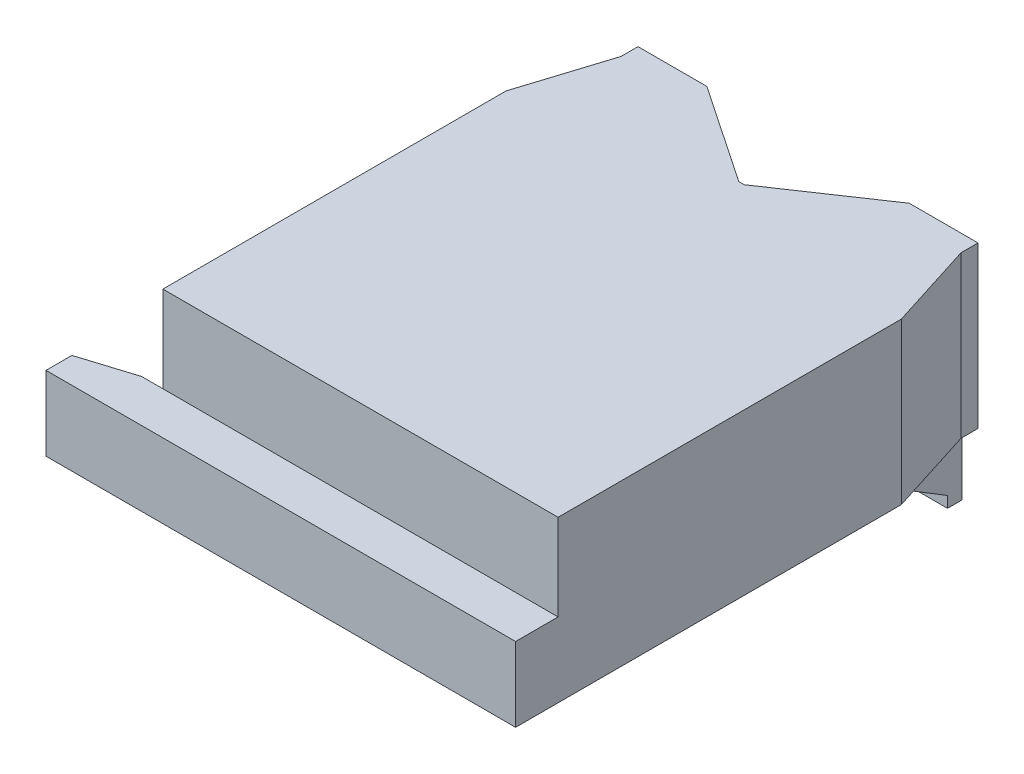
ISO-10303-21;
HEADER;
FILE_DESCRIPTION(('STEP AP214'),'2;1');
FILE_NAME('part.step','',(''),(''),'','','');
FILE_SCHEMA(('AUTOMOTIVE_DESIGN { 1 0 10303 214 1 1 1 1 }'));
ENDSEC;
DATA;
#1=APPLICATION_CONTEXT('core data for automotive mechanical design processes');
#2=APPLICATION_PROTOCOL_DEFINITION('international standard','automotive_design',2000,#1);
#3=PRODUCT_CONTEXT('',#1,'mechanical');
#4=PRODUCT('Part','Part','',(#3));
#5=PRODUCT_RELATED_PRODUCT_CATEGORY('part','',(#4));
#6=PRODUCT_DEFINITION_FORMATION('','',#4);
#7=PRODUCT_DEFINITION_CONTEXT('part definition',#1,'design');
#8=PRODUCT_DEFINITION('design','',#6,#7);
#9=PRODUCT_DEFINITION_SHAPE('','',#8);
#10=(LENGTH_UNIT() NAMED_UNIT(*) SI_UNIT(.MILLI.,.METRE.));
#11=(NAMED_UNIT(*) PLANE_ANGLE_UNIT() SI_UNIT($,.RADIAN.));
#12=(NAMED_UNIT(*) SI_UNIT($,.STERADIAN.) SOLID_ANGLE_UNIT());
#13=UNCERTAINTY_MEASURE_WITH_UNIT(LENGTH_MEASURE(1.E-05),#10,'distance_accuracy_value','');
#14=(GEOMETRIC_REPRESENTATION_CONTEXT(3) GLOBAL_UNCERTAINTY_ASSIGNED_CONTEXT((#13)) GLOBAL_UNIT_ASSIGNED_CONTEXT((#10,
#11,#12)) REPRESENTATION_CONTEXT('',''));
#15=CARTESIAN_POINT('',(0.,0.,0.));
#16=DIRECTION('',(0.,0.,1.));
#17=DIRECTION('',(1.,0.,0.));
#18=AXIS2_PLACEMENT_3D('',#15,#16,#17);
#19=CARTESIAN_POINT('',(-719.,2366.,1255.15));
#20=DIRECTION('',(0.,-1.,0.));
#21=DIRECTION('',(1.,0.,0.));
#22=AXIS2_PLACEMENT_3D('',#19,#20,#21);
#23=PLANE('',#22);
#24=DIRECTION('',(1.,0.,0.));
#25=VECTOR('',#24,1.);
#26=CARTESIAN_POINT('',(381.0784999709,2366.,-404.7));
#27=LINE('',#26,#25);
#28=CARTESIAN_POINT('',(381.0784999709,2366.,-404.7));
#29=VERTEX_POINT('',#28);
#30=CARTESIAN_POINT('',(640.,2366.,-404.7));
#31=VERTEX_POINT('',#30);
#32=EDGE_CURVE('E239',#29,#31,#27,.T.);
#33=ORIENTED_EDGE('',*,*,#32,.F.);
#34=DIRECTION('',(0.82903757255505,0.,-0.559192903470734));
#35=VECTOR('',#34,1.);
#36=CARTESIAN_POINT('',(10.,2366.,-154.404391352497));
#37=LINE('',#36,#35);
#38=CARTESIAN_POINT('',(10.,2366.,-154.404391352497));
#39=VERTEX_POINT('',#38);
#40=EDGE_CURVE('E42',#39,#29,#37,.T.);
#41=ORIENTED_EDGE('',*,*,#40,.F.);
#42=DIRECTION('',(1.,0.,0.));
#43=VECTOR('',#42,1.);
#44=CARTESIAN_POINT('',(-10.,2366.,-154.404391352497));
#45=LINE('',#44,#43);
#46=CARTESIAN_POINT('',(-10.,2366.,-154.404391352497));
#47=VERTEX_POINT('',#46);
#48=EDGE_CURVE('E391',#47,#39,#45,.T.);
#49=ORIENTED_EDGE('',*,*,#48,.F.);
#50=DIRECTION('',(0.82903757255505,0.,0.559192903470734));
#51=VECTOR('',#50,1.);
#52=CARTESIAN_POINT('',(-381.0784999709,2366.,-404.7));
#53=LINE('',#52,#51);
#54=CARTESIAN_POINT('',(-381.0784999709,2366.,-404.7));
#55=VERTEX_POINT('',#54);
#56=EDGE_CURVE('E228',#55,#47,#53,.T.);
#57=ORIENTED_EDGE('',*,*,#56,.F.);
#58=DIRECTION('',(1.,0.,0.));
#59=VECTOR('',#58,1.);
#60=CARTESIAN_POINT('',(-640.,2366.,-404.7));
#61=LINE('',#60,#59);
#62=CARTESIAN_POINT('',(-640.,2366.,-404.7));
#63=VERTEX_POINT('',#62);
#64=EDGE_CURVE('E238',#63,#55,#61,.T.);
#65=ORIENTED_EDGE('',*,*,#64,.F.);
#66=DIRECTION('',(0.,0.,-1.));
#67=VECTOR('',#66,1.);
#68=CARTESIAN_POINT('',(-640.,2366.,-340.6));
#69=LINE('',#68,#67);
#70=CARTESIAN_POINT('',(-640.,2366.,-340.6));
#71=VERTEX_POINT('',#70);
#72=EDGE_CURVE('E314',#71,#63,#69,.T.);
#73=ORIENTED_EDGE('',*,*,#72,.F.);
#74=DIRECTION('',(0.3018257621971,0.,-0.953363104632301));
#75=VECTOR('',#74,1.);
#76=CARTESIAN_POINT('',(-744.,2366.,-12.099999999997));
#77=LINE('',#76,#75);
#78=CARTESIAN_POINT('',(-744.,2366.,-12.099999999997));
#79=VERTEX_POINT('',#78);
#80=EDGE_CURVE('E262',#79,#71,#77,.T.);
#81=ORIENTED_EDGE('',*,*,#80,.F.);
#82=DIRECTION('',(0.,0.,-1.));
#83=VECTOR('',#82,1.);
#84=CARTESIAN_POINT('',(-744.,2366.,1280.15));
#85=LINE('',#84,#83);
#86=CARTESIAN_POINT('',(-744.,2366.,1280.15));
#87=VERTEX_POINT('',#86);
#88=EDGE_CURVE('E217',#87,#79,#85,.T.);
#89=ORIENTED_EDGE('',*,*,#88,.F.);
#90=DIRECTION('',(-1.,0.,0.));
#91=VECTOR('',#90,1.);
#92=CARTESIAN_POINT('',(744.,2366.,1280.15));
#93=LINE('',#92,#91);
#94=CARTESIAN_POINT('',(744.,2366.,1280.15));
#95=VERTEX_POINT('',#94);
#96=EDGE_CURVE('E271',#95,#87,#93,.T.);
#97=ORIENTED_EDGE('',*,*,#96,.F.);
#98=DIRECTION('',(0.,0.,1.));
#99=VECTOR('',#98,1.);
#100=CARTESIAN_POINT('',(744.,2366.,-12.099999999997));
#101=LINE('',#100,#99);
#102=CARTESIAN_POINT('',(744.,2366.,-12.099999999997));
#103=VERTEX_POINT('',#102);
#104=EDGE_CURVE('E256',#103,#95,#101,.T.);
#105=ORIENTED_EDGE('',*,*,#104,.F.);
#106=DIRECTION('',(0.3018257621971,0.,0.953363104632301));
#107=VECTOR('',#106,1.);
#108=CARTESIAN_POINT('',(640.,2366.,-340.6));
#109=LINE('',#108,#107);
#110=CARTESIAN_POINT('',(640.,2366.,-340.6));
#111=VERTEX_POINT('',#110);
#112=EDGE_CURVE('E186',#111,#103,#109,.T.);
#113=ORIENTED_EDGE('',*,*,#112,.F.);
#114=DIRECTION('',(0.,0.,1.));
#115=VECTOR('',#114,1.);
#116=CARTESIAN_POINT('',(640.,2366.,-404.7));
#117=LINE('',#116,#115);
#118=EDGE_CURVE('E28',#31,#111,#117,.T.);
#119=ORIENTED_EDGE('',*,*,#118,.F.);
#120=EDGE_LOOP('',(#33,#41,#49,#57,#65,#73,#81,#89,#97,#105,#113,#119));
#121=FACE_BOUND('',#120,.T.);
#122=ADVANCED_FACE('F17',(#121),#23,.F.);
#123=CARTESIAN_POINT('',(640.,2366.,-404.7));
#124=DIRECTION('',(1.,0.,0.));
#125=DIRECTION('',(0.,0.,1.));
#126=AXIS2_PLACEMENT_3D('',#123,#124,#125);
#127=PLANE('',#126);
#128=DIRECTION('',(0.,-1.,0.));
#129=VECTOR('',#128,1.);
#130=CARTESIAN_POINT('',(640.,2366.,-340.6));
#131=LINE('',#130,#129);
#132=CARTESIAN_POINT('',(640.,1761.,-340.6));
#133=VERTEX_POINT('',#132);
#134=EDGE_CURVE('E11',#111,#133,#131,.T.);
#135=ORIENTED_EDGE('',*,*,#134,.T.);
#136=DIRECTION('',(0.,0.,1.));
#137=VECTOR('',#136,1.);
#138=CARTESIAN_POINT('',(640.,1761.,-404.7));
#139=LINE('',#138,#137);
#140=CARTESIAN_POINT('',(640.,1761.,-404.7));
#141=VERTEX_POINT('',#140);
#142=EDGE_CURVE('E153',#141,#133,#139,.T.);
#143=ORIENTED_EDGE('',*,*,#142,.F.);
#144=DIRECTION('',(0.,-1.,0.));
#145=VECTOR('',#144,1.);
#146=CARTESIAN_POINT('',(640.,2366.,-404.7));
#147=LINE('',#146,#145);
#148=EDGE_CURVE('E227',#31,#141,#147,.T.);
#149=ORIENTED_EDGE('',*,*,#148,.F.);
#150=ORIENTED_EDGE('',*,*,#118,.T.);
#151=EDGE_LOOP('',(#135,#143,#149,#150));
#152=FACE_BOUND('',#151,.T.);
#153=ADVANCED_FACE('F170',(#152),#127,.T.);
#154=CARTESIAN_POINT('',(-640.,2366.,-404.7));
#155=DIRECTION('',(0.,0.,-1.));
#156=DIRECTION('',(0.,1.,0.));
#157=AXIS2_PLACEMENT_3D('',#154,#155,#156);
#158=PLANE('',#157);
#159=DIRECTION('',(1.,0.,0.));
#160=VECTOR('',#159,1.);
#161=CARTESIAN_POINT('',(-580.,1498.,-404.7));
#162=LINE('',#161,#160);
#163=CARTESIAN_POINT('',(-580.,1498.,-404.7));
#164=VERTEX_POINT('',#163);
#165=CARTESIAN_POINT('',(-381.0784999709,1498.,-404.7));
#166=VERTEX_POINT('',#165);
#167=EDGE_CURVE('E240',#164,#166,#162,.T.);
#168=ORIENTED_EDGE('',*,*,#167,.F.);
#169=DIRECTION('',(0.,1.,0.));
#170=VECTOR('',#169,1.);
#171=CARTESIAN_POINT('',(-580.,1498.,-404.7));
#172=LINE('',#171,#170);
#173=CARTESIAN_POINT('',(-580.,1761.,-404.7));
#174=VERTEX_POINT('',#173);
#175=EDGE_CURVE('E279',#164,#174,#172,.T.);
#176=ORIENTED_EDGE('',*,*,#175,.T.);
#177=DIRECTION('',(1.,0.,0.));
#178=VECTOR('',#177,1.);
#179=CARTESIAN_POINT('',(-640.,1761.,-404.7));
#180=LINE('',#179,#178);
#181=CARTESIAN_POINT('',(-640.,1761.,-404.7));
#182=VERTEX_POINT('',#181);
#183=EDGE_CURVE('E374',#182,#174,#180,.T.);
#184=ORIENTED_EDGE('',*,*,#183,.F.);
#185=DIRECTION('',(0.,-1.,0.));
#186=VECTOR('',#185,1.);
#187=CARTESIAN_POINT('',(-640.,2366.,-404.7));
#188=LINE('',#187,#186);
#189=EDGE_CURVE('E266',#63,#182,#188,.T.);
#190=ORIENTED_EDGE('',*,*,#189,.F.);
#191=ORIENTED_EDGE('',*,*,#64,.T.);
#192=DIRECTION('',(0.,-1.,0.));
#193=VECTOR('',#192,1.);
#194=CARTESIAN_POINT('',(-381.0784999709,2366.,-404.7));
#195=LINE('',#194,#193);
#196=EDGE_CURVE('E234',#55,#166,#195,.T.);
#197=ORIENTED_EDGE('',*,*,#196,.T.);
#198=EDGE_LOOP('',(#168,#176,#184,#190,#191,#197));
#199=FACE_BOUND('',#198,.T.);
#200=ADVANCED_FACE('F655',(#199),#158,.T.);
#201=CARTESIAN_POINT('',(-640.,2366.,-404.7));
#202=DIRECTION('',(0.,0.,-1.));
#203=DIRECTION('',(0.,1.,0.));
#204=AXIS2_PLACEMENT_3D('',#201,#202,#203);
#205=PLANE('',#204);
#206=ORIENTED_EDGE('',*,*,#32,.T.);
#207=ORIENTED_EDGE('',*,*,#148,.T.);
#208=DIRECTION('',(1.,0.,0.));
#209=VECTOR('',#208,1.);
#210=CARTESIAN_POINT('',(580.,1761.,-404.7));
#211=LINE('',#210,#209);
#212=CARTESIAN_POINT('',(580.,1761.,-404.7));
#213=VERTEX_POINT('',#212);
#214=EDGE_CURVE('E162',#213,#141,#211,.T.);
#215=ORIENTED_EDGE('',*,*,#214,.F.);
#216=DIRECTION('',(0.,1.,0.));
#217=VECTOR('',#216,1.);
#218=CARTESIAN_POINT('',(580.,1498.,-404.7));
#219=LINE('',#218,#217);
#220=CARTESIAN_POINT('',(580.,1498.,-404.7));
#221=VERTEX_POINT('',#220);
#222=EDGE_CURVE('E310',#221,#213,#219,.T.);
#223=ORIENTED_EDGE('',*,*,#222,.F.);
#224=DIRECTION('',(1.,0.,0.));
#225=VECTOR('',#224,1.);
#226=CARTESIAN_POINT('',(381.0784999709,1498.,-404.7));
#227=LINE('',#226,#225);
#228=CARTESIAN_POINT('',(381.0784999709,1498.,-404.7));
#229=VERTEX_POINT('',#228);
#230=EDGE_CURVE('E245',#229,#221,#227,.T.);
#231=ORIENTED_EDGE('',*,*,#230,.F.);
#232=DIRECTION('',(0.,1.,0.));
#233=VECTOR('',#232,1.);
#234=CARTESIAN_POINT('',(381.0784999709,1498.,-404.7));
#235=LINE('',#234,#233);
#236=EDGE_CURVE('E223',#229,#29,#235,.T.);
#237=ORIENTED_EDGE('',*,*,#236,.T.);
#238=EDGE_LOOP('',(#206,#207,#215,#223,#231,#237));
#239=FACE_BOUND('',#238,.T.);
#240=ADVANCED_FACE('F663',(#239),#205,.T.);
#241=CARTESIAN_POINT('',(-381.0784999709,2366.,-404.7));
#242=DIRECTION('',(0.559192903470734,0.,-0.82903757255505));
#243=DIRECTION('',(0.,1.,0.));
#244=AXIS2_PLACEMENT_3D('',#241,#242,#243);
#245=PLANE('',#244);
#246=ORIENTED_EDGE('',*,*,#56,.T.);
#247=DIRECTION('',(0.,-1.,0.));
#248=VECTOR('',#247,1.);
#249=CARTESIAN_POINT('',(-10.,2366.,-154.404391352497));
#250=LINE('',#249,#248);
#251=CARTESIAN_POINT('',(-10.,1659.5079017608,-154.404391352497));
#252=VERTEX_POINT('',#251);
#253=EDGE_CURVE('E318',#47,#252,#250,.T.);
#254=ORIENTED_EDGE('',*,*,#253,.T.);
#255=DIRECTION('',(0.784408083260296,0.323678547148599,0.529089932839097));
#256=VECTOR('',#255,1.);
#257=CARTESIAN_POINT('',(-299.760030848,1539.9411764706,-349.85));
#258=LINE('',#257,#256);
#259=CARTESIAN_POINT('',(-299.760030848,1539.9411764706,-349.85));
#260=VERTEX_POINT('',#259);
#261=EDGE_CURVE('E297',#260,#252,#258,.T.);
#262=ORIENTED_EDGE('',*,*,#261,.F.);
#263=DIRECTION('',(0.,-1.,0.));
#264=VECTOR('',#263,1.);
#265=CARTESIAN_POINT('',(-299.760030848,1539.9411764706,-349.85));
#266=LINE('',#265,#264);
#267=CARTESIAN_POINT('',(-299.760030848,1498.,-349.85));
#268=VERTEX_POINT('',#267);
#269=EDGE_CURVE('E428',#260,#268,#266,.T.);
#270=ORIENTED_EDGE('',*,*,#269,.T.);
#271=DIRECTION('',(-0.82903757255505,0.,-0.559192903470734));
#272=VECTOR('',#271,1.);
#273=CARTESIAN_POINT('',(-299.760030848,1498.,-349.85));
#274=LINE('',#273,#272);
#275=EDGE_CURVE('E326',#268,#166,#274,.T.);
#276=ORIENTED_EDGE('',*,*,#275,.T.);
#277=ORIENTED_EDGE('',*,*,#196,.F.);
#278=EDGE_LOOP('',(#246,#254,#262,#270,#276,#277));
#279=FACE_BOUND('',#278,.T.);
#280=ADVANCED_FACE('F550',(#279),#245,.T.);
#281=CARTESIAN_POINT('',(-580.,1498.,-349.85));
#282=DIRECTION('',(0.,-1.,0.));
#283=DIRECTION('',(1.,0.,0.));
#284=AXIS2_PLACEMENT_3D('',#281,#282,#283);
#285=PLANE('',#284);
#286=DIRECTION('',(1.,0.,0.));
#287=VECTOR('',#286,1.);
#288=CARTESIAN_POINT('',(-580.,1498.,-349.85));
#289=LINE('',#288,#287);
#290=CARTESIAN_POINT('',(-580.,1498.,-349.85));
#291=VERTEX_POINT('',#290);
#292=EDGE_CURVE('E302',#291,#268,#289,.T.);
#293=ORIENTED_EDGE('',*,*,#292,.F.);
#294=DIRECTION('',(0.,0.,-1.));
#295=VECTOR('',#294,1.);
#296=CARTESIAN_POINT('',(-580.,1498.,-349.85));
#297=LINE('',#296,#295);
#298=EDGE_CURVE('E244',#291,#164,#297,.T.);
#299=ORIENTED_EDGE('',*,*,#298,.T.);
#300=ORIENTED_EDGE('',*,*,#167,.T.);
#301=ORIENTED_EDGE('',*,*,#275,.F.);
#302=EDGE_LOOP('',(#293,#299,#300,#301));
#303=FACE_BOUND('',#302,.T.);
#304=ADVANCED_FACE('F662',(#303),#285,.T.);
#305=CARTESIAN_POINT('',(-580.,1498.,-349.85));
#306=DIRECTION('',(0.,-1.,0.));
#307=DIRECTION('',(1.,0.,0.));
#308=AXIS2_PLACEMENT_3D('',#305,#306,#307);
#309=PLANE('',#308);
#310=ORIENTED_EDGE('',*,*,#230,.T.);
#311=DIRECTION('',(0.,0.,-1.));
#312=VECTOR('',#311,1.);
#313=CARTESIAN_POINT('',(580.,1498.,-349.85));
#314=LINE('',#313,#312);
#315=CARTESIAN_POINT('',(580.,1498.,-349.85));
#316=VERTEX_POINT('',#315);
#317=EDGE_CURVE('E395',#316,#221,#314,.T.);
#318=ORIENTED_EDGE('',*,*,#317,.F.);
#319=DIRECTION('',(1.,0.,0.));
#320=VECTOR('',#319,1.);
#321=CARTESIAN_POINT('',(299.760030848,1498.,-349.85));
#322=LINE('',#321,#320);
#323=CARTESIAN_POINT('',(299.760030848,1498.,-349.85));
#324=VERTEX_POINT('',#323);
#325=EDGE_CURVE('E298',#324,#316,#322,.T.);
#326=ORIENTED_EDGE('',*,*,#325,.F.);
#327=DIRECTION('',(0.82903757255505,0.,-0.559192903470734));
#328=VECTOR('',#327,1.);
#329=CARTESIAN_POINT('',(299.760030848,1498.,-349.85));
#330=LINE('',#329,#328);
#331=EDGE_CURVE('E368',#324,#229,#330,.T.);
#332=ORIENTED_EDGE('',*,*,#331,.T.);
#333=EDGE_LOOP('',(#310,#318,#326,#332));
#334=FACE_BOUND('',#333,.T.);
#335=ADVANCED_FACE('F671',(#334),#309,.T.);
#336=CARTESIAN_POINT('',(-580.,1761.,-504.85));
#337=DIRECTION('',(1.,0.,0.));
#338=DIRECTION('',(0.,0.,1.));
#339=AXIS2_PLACEMENT_3D('',#336,#337,#338);
#340=PLANE('',#339);
#341=DIRECTION('',(0.,0.,1.));
#342=VECTOR('',#341,1.);
#343=CARTESIAN_POINT('',(-580.,1761.,-404.7));
#344=LINE('',#343,#342);
#345=CARTESIAN_POINT('',(-580.,1761.,11.4961538462029));
#346=VERTEX_POINT('',#345);
#347=EDGE_CURVE('E384',#174,#346,#344,.T.);
#348=ORIENTED_EDGE('',*,*,#347,.F.);
#349=ORIENTED_EDGE('',*,*,#175,.F.);
#350=ORIENTED_EDGE('',*,*,#298,.F.);
#351=DIRECTION('',(0.,-1.,0.));
#352=VECTOR('',#351,1.);
#353=CARTESIAN_POINT('',(-580.,1539.9411764706,-349.85));
#354=LINE('',#353,#352);
#355=CARTESIAN_POINT('',(-580.,1539.9411764706,-349.85));
#356=VERTEX_POINT('',#355);
#357=EDGE_CURVE('E322',#356,#291,#354,.T.);
#358=ORIENTED_EDGE('',*,*,#357,.F.);
#359=DIRECTION('',(0.,-0.52185588847421,-0.853033663852016));
#360=VECTOR('',#359,1.);
#361=CARTESIAN_POINT('',(-580.,1761.,11.4961538462029));
#362=LINE('',#361,#360);
#363=EDGE_CURVE('E199',#346,#356,#362,.T.);
#364=ORIENTED_EDGE('',*,*,#363,.F.);
#365=EDGE_LOOP('',(#348,#349,#350,#358,#364));
#366=FACE_BOUND('',#365,.T.);
#367=ADVANCED_FACE('F568',(#366),#340,.F.);
#368=CARTESIAN_POINT('',(-580.,1761.,11.4961538462029));
#369=DIRECTION('',(0.,-0.853033663852016,0.52185588847421));
#370=DIRECTION('',(1.,0.,0.));
#371=AXIS2_PLACEMENT_3D('',#368,#369,#370);
#372=PLANE('',#371);
#373=DIRECTION('',(1.,0.,0.));
#374=VECTOR('',#373,1.);
#375=CARTESIAN_POINT('',(-10.,1659.5079017608,-154.404391352497));
#376=LINE('',#375,#374);
#377=CARTESIAN_POINT('',(10.,1659.5079017608,-154.404391352497));
#378=VERTEX_POINT('',#377);
#379=EDGE_CURVE('E198',#252,#378,#376,.T.);
#380=ORIENTED_EDGE('',*,*,#379,.T.);
#381=DIRECTION('',(-0.784408083260296,0.323678547148599,0.529089932839097));
#382=VECTOR('',#381,1.);
#383=CARTESIAN_POINT('',(299.760030848,1539.9411764706,-349.85));
#384=LINE('',#383,#382);
#385=CARTESIAN_POINT('',(299.760030848,1539.9411764706,-349.85));
#386=VERTEX_POINT('',#385);
#387=EDGE_CURVE('E292',#386,#378,#384,.T.);
#388=ORIENTED_EDGE('',*,*,#387,.F.);
#389=DIRECTION('',(1.,0.,0.));
#390=VECTOR('',#389,1.);
#391=CARTESIAN_POINT('',(299.760030848,1539.9411764706,-349.85));
#392=LINE('',#391,#390);
#393=CARTESIAN_POINT('',(580.,1539.9411764706,-349.85));
#394=VERTEX_POINT('',#393);
#395=EDGE_CURVE('E194',#386,#394,#392,.T.);
#396=ORIENTED_EDGE('',*,*,#395,.T.);
#397=DIRECTION('',(0.,-0.52185588847421,-0.853033663852016));
#398=VECTOR('',#397,1.);
#399=CARTESIAN_POINT('',(580.,1761.,11.4961538462029));
#400=LINE('',#399,#398);
#401=CARTESIAN_POINT('',(580.,1761.,11.4961538462029));
#402=VERTEX_POINT('',#401);
#403=EDGE_CURVE('E232',#402,#394,#400,.T.);
#404=ORIENTED_EDGE('',*,*,#403,.F.);
#405=DIRECTION('',(1.,0.,0.));
#406=VECTOR('',#405,1.);
#407=CARTESIAN_POINT('',(-580.,1761.,11.4961538462029));
#408=LINE('',#407,#406);
#409=EDGE_CURVE('E355',#346,#402,#408,.T.);
#410=ORIENTED_EDGE('',*,*,#409,.F.);
#411=ORIENTED_EDGE('',*,*,#363,.T.);
#412=DIRECTION('',(1.,0.,0.));
#413=VECTOR('',#412,1.);
#414=CARTESIAN_POINT('',(-580.,1539.9411764706,-349.85));
#415=LINE('',#414,#413);
#416=EDGE_CURVE('E293',#356,#260,#415,.T.);
#417=ORIENTED_EDGE('',*,*,#416,.T.);
#418=ORIENTED_EDGE('',*,*,#261,.T.);
#419=EDGE_LOOP('',(#380,#388,#396,#404,#410,#411,#417,#418));
#420=FACE_BOUND('',#419,.T.);
#421=ADVANCED_FACE('F559',(#420),#372,.T.);
#422=CARTESIAN_POINT('',(-580.,1539.9411764706,-349.85));
#423=DIRECTION('',(0.,0.,1.));
#424=DIRECTION('',(1.,0.,0.));
#425=AXIS2_PLACEMENT_3D('',#422,#423,#424);
#426=PLANE('',#425);
#427=ORIENTED_EDGE('',*,*,#416,.F.);
#428=ORIENTED_EDGE('',*,*,#357,.T.);
#429=ORIENTED_EDGE('',*,*,#292,.T.);
#430=ORIENTED_EDGE('',*,*,#269,.F.);
#431=EDGE_LOOP('',(#427,#428,#429,#430));
#432=FACE_BOUND('',#431,.T.);
#433=ADVANCED_FACE('F556',(#432),#426,.T.);
#434=CARTESIAN_POINT('',(-580.,1539.9411764706,-349.85));
#435=DIRECTION('',(0.,0.,1.));
#436=DIRECTION('',(1.,0.,0.));
#437=AXIS2_PLACEMENT_3D('',#434,#435,#436);
#438=PLANE('',#437);
#439=ORIENTED_EDGE('',*,*,#325,.T.);
#440=DIRECTION('',(0.,-1.,0.));
#441=VECTOR('',#440,1.);
#442=CARTESIAN_POINT('',(580.,1539.9411764706,-349.85));
#443=LINE('',#442,#441);
#444=EDGE_CURVE('E392',#394,#316,#443,.T.);
#445=ORIENTED_EDGE('',*,*,#444,.F.);
#446=ORIENTED_EDGE('',*,*,#395,.F.);
#447=DIRECTION('',(0.,-1.,0.));
#448=VECTOR('',#447,1.);
#449=CARTESIAN_POINT('',(299.760030848,1539.9411764706,-349.85));
#450=LINE('',#449,#448);
#451=EDGE_CURVE('E291',#386,#324,#450,.T.);
#452=ORIENTED_EDGE('',*,*,#451,.T.);
#453=EDGE_LOOP('',(#439,#445,#446,#452));
#454=FACE_BOUND('',#453,.T.);
#455=ADVANCED_FACE('F666',(#454),#438,.T.);
#456=CARTESIAN_POINT('',(10.,2366.,-154.404391352497));
#457=DIRECTION('',(-0.559192903470734,0.,-0.82903757255505));
#458=DIRECTION('',(-0.82903757255505,0.,0.559192903470734));
#459=AXIS2_PLACEMENT_3D('',#456,#457,#458);
#460=PLANE('',#459);
#461=ORIENTED_EDGE('',*,*,#40,.T.);
#462=ORIENTED_EDGE('',*,*,#236,.F.);
#463=ORIENTED_EDGE('',*,*,#331,.F.);
#464=ORIENTED_EDGE('',*,*,#451,.F.);
#465=ORIENTED_EDGE('',*,*,#387,.T.);
#466=DIRECTION('',(0.,-1.,0.));
#467=VECTOR('',#466,1.);
#468=CARTESIAN_POINT('',(10.,2366.,-154.404391352497));
#469=LINE('',#468,#467);
#470=EDGE_CURVE('E388',#39,#378,#469,.T.);
#471=ORIENTED_EDGE('',*,*,#470,.F.);
#472=EDGE_LOOP('',(#461,#462,#463,#464,#465,#471));
#473=FACE_BOUND('',#472,.T.);
#474=ADVANCED_FACE('F667',(#473),#460,.T.);
#475=CARTESIAN_POINT('',(-10.,2366.,-154.404391352497));
#476=DIRECTION('',(0.,0.,-1.));
#477=DIRECTION('',(0.,1.,0.));
#478=AXIS2_PLACEMENT_3D('',#475,#476,#477);
#479=PLANE('',#478);
#480=ORIENTED_EDGE('',*,*,#48,.T.);
#481=ORIENTED_EDGE('',*,*,#470,.T.);
#482=ORIENTED_EDGE('',*,*,#379,.F.);
#483=ORIENTED_EDGE('',*,*,#253,.F.);
#484=EDGE_LOOP('',(#480,#481,#482,#483));
#485=FACE_BOUND('',#484,.T.);
#486=ADVANCED_FACE('F669',(#485),#479,.T.);
#487=CARTESIAN_POINT('',(580.,1761.,-504.85));
#488=DIRECTION('',(-1.,0.,0.));
#489=DIRECTION('',(0.,-1.,0.));
#490=AXIS2_PLACEMENT_3D('',#487,#488,#489);
#491=PLANE('',#490);
#492=ORIENTED_EDGE('',*,*,#444,.T.);
#493=ORIENTED_EDGE('',*,*,#317,.T.);
#494=ORIENTED_EDGE('',*,*,#222,.T.);
#495=DIRECTION('',(0.,0.,1.));
#496=VECTOR('',#495,1.);
#497=CARTESIAN_POINT('',(580.,1761.,-404.7));
#498=LINE('',#497,#496);
#499=EDGE_CURVE('E306',#213,#402,#498,.T.);
#500=ORIENTED_EDGE('',*,*,#499,.T.);
#501=ORIENTED_EDGE('',*,*,#403,.T.);
#502=EDGE_LOOP('',(#492,#493,#494,#500,#501));
#503=FACE_BOUND('',#502,.T.);
#504=ADVANCED_FACE('F695',(#503),#491,.F.);
#505=CARTESIAN_POINT('',(993.25,1761.,31.6500000000029));
#506=DIRECTION('',(0.,1.,0.));
#507=DIRECTION('',(0.,0.,-1.));
#508=AXIS2_PLACEMENT_3D('',#505,#506,#507);
#509=PLANE('',#508);
#510=DIRECTION('',(0.3018257621971,0.,-0.953363104632301));
#511=VECTOR('',#510,1.);
#512=CARTESIAN_POINT('',(-744.,1761.,-12.099999999997));
#513=LINE('',#512,#511);
#514=CARTESIAN_POINT('',(-744.,1761.,-12.099999999997));
#515=VERTEX_POINT('',#514);
#516=CARTESIAN_POINT('',(-640.,1761.,-340.6));
#517=VERTEX_POINT('',#516);
#518=EDGE_CURVE('E229',#515,#517,#513,.T.);
#519=ORIENTED_EDGE('',*,*,#518,.T.);
#520=DIRECTION('',(0.,0.,-1.));
#521=VECTOR('',#520,1.);
#522=CARTESIAN_POINT('',(-640.,1761.,-340.6));
#523=LINE('',#522,#521);
#524=EDGE_CURVE('E233',#517,#182,#523,.T.);
#525=ORIENTED_EDGE('',*,*,#524,.T.);
#526=ORIENTED_EDGE('',*,*,#183,.T.);
#527=ORIENTED_EDGE('',*,*,#347,.T.);
#528=ORIENTED_EDGE('',*,*,#409,.T.);
#529=ORIENTED_EDGE('',*,*,#499,.F.);
#530=ORIENTED_EDGE('',*,*,#214,.T.);
#531=ORIENTED_EDGE('',*,*,#142,.T.);
#532=DIRECTION('',(0.3018257621971,0.,0.953363104632301));
#533=VECTOR('',#532,1.);
#534=CARTESIAN_POINT('',(640.,1761.,-340.6));
#535=LINE('',#534,#533);
#536=CARTESIAN_POINT('',(744.,1761.,-12.099999999997));
#537=VERTEX_POINT('',#536);
#538=EDGE_CURVE('E158',#133,#537,#535,.T.);
#539=ORIENTED_EDGE('',*,*,#538,.T.);
#540=DIRECTION('',(0.,0.,1.));
#541=VECTOR('',#540,1.);
#542=CARTESIAN_POINT('',(744.,1761.,-12.099999999997));
#543=LINE('',#542,#541);
#544=CARTESIAN_POINT('',(744.,1761.,1440.15));
#545=VERTEX_POINT('',#544);
#546=EDGE_CURVE('E178',#537,#545,#543,.T.);
#547=ORIENTED_EDGE('',*,*,#546,.T.);
#548=DIRECTION('',(1.,0.,0.));
#549=VECTOR('',#548,1.);
#550=CARTESIAN_POINT('',(-1024.,1761.,1440.15));
#551=LINE('',#550,#549);
#552=CARTESIAN_POINT('',(-1024.,1761.,1440.15));
#553=VERTEX_POINT('',#552);
#554=EDGE_CURVE('E246',#553,#545,#551,.T.);
#555=ORIENTED_EDGE('',*,*,#554,.F.);
#556=DIRECTION('',(0.,0.,1.));
#557=VECTOR('',#556,1.);
#558=CARTESIAN_POINT('',(-1024.,1761.,1342.65));
#559=LINE('',#558,#557);
#560=CARTESIAN_POINT('',(-1024.,1761.,1342.65));
#561=VERTEX_POINT('',#560);
#562=EDGE_CURVE('E409',#561,#553,#559,.T.);
#563=ORIENTED_EDGE('',*,*,#562,.F.);
#564=DIRECTION('',(-0.95447997803504,0.,0.298274993135912));
#565=VECTOR('',#564,1.);
#566=CARTESIAN_POINT('',(-824.,1761.,1280.15));
#567=LINE('',#566,#565);
#568=CARTESIAN_POINT('',(-824.,1761.,1280.15));
#569=VERTEX_POINT('',#568);
#570=EDGE_CURVE('E261',#569,#561,#567,.T.);
#571=ORIENTED_EDGE('',*,*,#570,.F.);
#572=DIRECTION('',(-1.,0.,0.));
#573=VECTOR('',#572,1.);
#574=CARTESIAN_POINT('',(-744.,1761.,1280.15));
#575=LINE('',#574,#573);
#576=CARTESIAN_POINT('',(-744.,1761.,1280.15));
#577=VERTEX_POINT('',#576);
#578=EDGE_CURVE('E208',#577,#569,#575,.T.);
#579=ORIENTED_EDGE('',*,*,#578,.F.);
#580=DIRECTION('',(0.,0.,-1.));
#581=VECTOR('',#580,1.);
#582=CARTESIAN_POINT('',(-744.,1761.,1280.15));
#583=LINE('',#582,#581);
#584=CARTESIAN_POINT('',(-744.,1761.,787.15));
#585=VERTEX_POINT('',#584);
#586=EDGE_CURVE('E182',#577,#585,#583,.T.);
#587=ORIENTED_EDGE('',*,*,#586,.T.);
#588=DIRECTION('',(-1.,0.,0.));
#589=VECTOR('',#588,1.);
#590=CARTESIAN_POINT('',(-744.,1761.,787.15));
#591=LINE('',#590,#589);
#592=CARTESIAN_POINT('',(-1154.5,1761.,787.15));
#593=VERTEX_POINT('',#592);
#594=EDGE_CURVE('E212',#585,#593,#591,.T.);
#595=ORIENTED_EDGE('',*,*,#594,.T.);
#596=DIRECTION('',(0.,0.,1.));
#597=VECTOR('',#596,1.);
#598=CARTESIAN_POINT('',(-1154.5,1761.,8.65000000000283));
#599=LINE('',#598,#597);
#600=CARTESIAN_POINT('',(-1154.5,1761.,8.65000000000283));
#601=VERTEX_POINT('',#600);
#602=EDGE_CURVE('E193',#601,#593,#599,.T.);
#603=ORIENTED_EDGE('',*,*,#602,.F.);
#604=DIRECTION('',(-1.,0.,0.));
#605=VECTOR('',#604,1.);
#606=CARTESIAN_POINT('',(-744.,1761.,8.65000000000283));
#607=LINE('',#606,#605);
#608=CARTESIAN_POINT('',(-744.,1761.,8.65000000000283));
#609=VERTEX_POINT('',#608);
#610=EDGE_CURVE('E21',#609,#601,#607,.T.);
#611=ORIENTED_EDGE('',*,*,#610,.F.);
#612=DIRECTION('',(0.,0.,-1.));
#613=VECTOR('',#612,1.);
#614=CARTESIAN_POINT('',(-744.,1761.,8.65000000000283));
#615=LINE('',#614,#613);
#616=EDGE_CURVE('E349',#609,#515,#615,.T.);
#617=ORIENTED_EDGE('',*,*,#616,.T.);
#618=EDGE_LOOP('',(#519,#525,#526,#527,#528,#529,#530,#531,#539,#547,#555,#563,#571,#579,#587,
#595,#603,#611,#617));
#619=FACE_BOUND('',#618,.T.);
#620=ADVANCED_FACE('F155',(#619),#509,.F.);
#621=CARTESIAN_POINT('',(-744.,2366.,1280.15));
#622=DIRECTION('',(-1.,0.,0.));
#623=DIRECTION('',(0.,-1.,0.));
#624=AXIS2_PLACEMENT_3D('',#621,#622,#623);
#625=PLANE('',#624);
#626=ORIENTED_EDGE('',*,*,#586,.F.);
#627=DIRECTION('',(0.,1.,0.));
#628=VECTOR('',#627,1.);
#629=CARTESIAN_POINT('',(-744.,1761.,1280.15));
#630=LINE('',#629,#628);
#631=CARTESIAN_POINT('',(-744.,2041.,1280.15));
#632=VERTEX_POINT('',#631);
#633=EDGE_CURVE('E345',#577,#632,#630,.T.);
#634=ORIENTED_EDGE('',*,*,#633,.T.);
#635=DIRECTION('',(0.,-1.,0.));
#636=VECTOR('',#635,1.);
#637=CARTESIAN_POINT('',(-744.,2366.,1280.15));
#638=LINE('',#637,#636);
#639=EDGE_CURVE('E267',#87,#632,#638,.T.);
#640=ORIENTED_EDGE('',*,*,#639,.F.);
#641=ORIENTED_EDGE('',*,*,#88,.T.);
#642=DIRECTION('',(0.,-1.,0.));
#643=VECTOR('',#642,1.);
#644=CARTESIAN_POINT('',(-744.,2366.,-12.099999999997));
#645=LINE('',#644,#643);
#646=EDGE_CURVE('E213',#79,#515,#645,.T.);
#647=ORIENTED_EDGE('',*,*,#646,.T.);
#648=ORIENTED_EDGE('',*,*,#616,.F.);
#649=DIRECTION('',(0.,1.,0.));
#650=VECTOR('',#649,1.);
#651=CARTESIAN_POINT('',(-744.,1761.,8.65000000000283));
#652=LINE('',#651,#650);
#653=CARTESIAN_POINT('',(-744.,1926.,8.65000000000282));
#654=VERTEX_POINT('',#653);
#655=EDGE_CURVE('E218',#609,#654,#652,.T.);
#656=ORIENTED_EDGE('',*,*,#655,.T.);
#657=DIRECTION('',(0.,0.,-1.));
#658=VECTOR('',#657,1.);
#659=CARTESIAN_POINT('',(-744.,1926.,787.15));
#660=LINE('',#659,#658);
#661=CARTESIAN_POINT('',(-744.,1926.,787.15));
#662=VERTEX_POINT('',#661);
#663=EDGE_CURVE('E204',#662,#654,#660,.T.);
#664=ORIENTED_EDGE('',*,*,#663,.F.);
#665=DIRECTION('',(0.,1.,0.));
#666=VECTOR('',#665,1.);
#667=CARTESIAN_POINT('',(-744.,1761.,787.15));
#668=LINE('',#667,#666);
#669=EDGE_CURVE('E222',#585,#662,#668,.T.);
#670=ORIENTED_EDGE('',*,*,#669,.F.);
#671=EDGE_LOOP('',(#626,#634,#640,#641,#647,#648,#656,#664,#670));
#672=FACE_BOUND('',#671,.T.);
#673=ADVANCED_FACE('F453',(#672),#625,.T.);
#674=CARTESIAN_POINT('',(-744.,1761.,787.15));
#675=DIRECTION('',(0.,0.,1.));
#676=DIRECTION('',(1.,0.,0.));
#677=AXIS2_PLACEMENT_3D('',#674,#675,#676);
#678=PLANE('',#677);
#679=ORIENTED_EDGE('',*,*,#669,.T.);
#680=DIRECTION('',(-1.,0.,0.));
#681=VECTOR('',#680,1.);
#682=CARTESIAN_POINT('',(-744.,1926.,787.15));
#683=LINE('',#682,#681);
#684=CARTESIAN_POINT('',(-1154.5,1926.,787.15));
#685=VERTEX_POINT('',#684);
#686=EDGE_CURVE('E288',#662,#685,#683,.T.);
#687=ORIENTED_EDGE('',*,*,#686,.T.);
#688=DIRECTION('',(0.,1.,0.));
#689=VECTOR('',#688,1.);
#690=CARTESIAN_POINT('',(-1154.5,1761.,787.15));
#691=LINE('',#690,#689);
#692=EDGE_CURVE('E273',#593,#685,#691,.T.);
#693=ORIENTED_EDGE('',*,*,#692,.F.);
#694=ORIENTED_EDGE('',*,*,#594,.F.);
#695=EDGE_LOOP('',(#679,#687,#693,#694));
#696=FACE_BOUND('',#695,.T.);
#697=ADVANCED_FACE('F705',(#696),#678,.T.);
#698=CARTESIAN_POINT('',(-1154.5,1761.,-504.85));
#699=DIRECTION('',(-1.,0.,0.));
#700=DIRECTION('',(0.,-1.,0.));
#701=AXIS2_PLACEMENT_3D('',#698,#699,#700);
#702=PLANE('',#701);
#703=DIRECTION('',(0.,0.,-1.));
#704=VECTOR('',#703,1.);
#705=CARTESIAN_POINT('',(-1154.5,1926.,787.15));
#706=LINE('',#705,#704);
#707=CARTESIAN_POINT('',(-1154.5,1926.,8.65000000000282));
#708=VERTEX_POINT('',#707);
#709=EDGE_CURVE('E192',#685,#708,#706,.T.);
#710=ORIENTED_EDGE('',*,*,#709,.T.);
#711=DIRECTION('',(0.,-1.,0.));
#712=VECTOR('',#711,1.);
#713=CARTESIAN_POINT('',(-1154.5,1926.,8.65000000000282));
#714=LINE('',#713,#712);
#715=EDGE_CURVE('E188',#708,#601,#714,.T.);
#716=ORIENTED_EDGE('',*,*,#715,.T.);
#717=ORIENTED_EDGE('',*,*,#602,.T.);
#718=ORIENTED_EDGE('',*,*,#692,.T.);
#719=EDGE_LOOP('',(#710,#716,#717,#718));
#720=FACE_BOUND('',#719,.T.);
#721=ADVANCED_FACE('F708',(#720),#702,.T.);
#722=CARTESIAN_POINT('',(-744.,1926.,8.65000000000282));
#723=DIRECTION('',(0.,0.,-1.));
#724=DIRECTION('',(0.,1.,0.));
#725=AXIS2_PLACEMENT_3D('',#722,#723,#724);
#726=PLANE('',#725);
#727=ORIENTED_EDGE('',*,*,#655,.F.);
#728=ORIENTED_EDGE('',*,*,#610,.T.);
#729=ORIENTED_EDGE('',*,*,#715,.F.);
#730=DIRECTION('',(-1.,0.,0.));
#731=VECTOR('',#730,1.);
#732=CARTESIAN_POINT('',(-744.,1926.,8.65000000000282));
#733=LINE('',#732,#731);
#734=EDGE_CURVE('E200',#654,#708,#733,.T.);
#735=ORIENTED_EDGE('',*,*,#734,.F.);
#736=EDGE_LOOP('',(#727,#728,#729,#735));
#737=FACE_BOUND('',#736,.T.);
#738=ADVANCED_FACE('F658',(#737),#726,.T.);
#739=CARTESIAN_POINT('',(-744.,1926.,787.15));
#740=DIRECTION('',(0.,1.,0.));
#741=DIRECTION('',(0.,0.,-1.));
#742=AXIS2_PLACEMENT_3D('',#739,#740,#741);
#743=PLANE('',#742);
#744=ORIENTED_EDGE('',*,*,#663,.T.);
#745=ORIENTED_EDGE('',*,*,#734,.T.);
#746=ORIENTED_EDGE('',*,*,#709,.F.);
#747=ORIENTED_EDGE('',*,*,#686,.F.);
#748=EDGE_LOOP('',(#744,#745,#746,#747));
#749=FACE_BOUND('',#748,.T.);
#750=ADVANCED_FACE('F692',(#749),#743,.T.);
#751=CARTESIAN_POINT('',(-744.,2366.,-12.099999999997));
#752=DIRECTION('',(-0.953363104632301,0.,-0.301825762197101));
#753=DIRECTION('',(-0.301825762197101,0.,0.953363104632301));
#754=AXIS2_PLACEMENT_3D('',#751,#752,#753);
#755=PLANE('',#754);
#756=DIRECTION('',(0.,-1.,0.));
#757=VECTOR('',#756,1.);
#758=CARTESIAN_POINT('',(-640.,2366.,-340.6));
#759=LINE('',#758,#757);
#760=EDGE_CURVE('E205',#71,#517,#759,.T.);
#761=ORIENTED_EDGE('',*,*,#760,.T.);
#762=ORIENTED_EDGE('',*,*,#518,.F.);
#763=ORIENTED_EDGE('',*,*,#646,.F.);
#764=ORIENTED_EDGE('',*,*,#80,.T.);
#765=EDGE_LOOP('',(#761,#762,#763,#764));
#766=FACE_BOUND('',#765,.T.);
#767=ADVANCED_FACE('F450',(#766),#755,.T.);
#768=CARTESIAN_POINT('',(-640.,2366.,-340.6));
#769=DIRECTION('',(-1.,0.,0.));
#770=DIRECTION('',(0.,-1.,0.));
#771=AXIS2_PLACEMENT_3D('',#768,#769,#770);
#772=PLANE('',#771);
#773=ORIENTED_EDGE('',*,*,#189,.T.);
#774=ORIENTED_EDGE('',*,*,#524,.F.);
#775=ORIENTED_EDGE('',*,*,#760,.F.);
#776=ORIENTED_EDGE('',*,*,#72,.T.);
#777=EDGE_LOOP('',(#773,#774,#775,#776));
#778=FACE_BOUND('',#777,.T.);
#779=ADVANCED_FACE('F675',(#778),#772,.T.);
#780=CARTESIAN_POINT('',(744.,2366.,1280.15));
#781=DIRECTION('',(0.,0.,1.));
#782=DIRECTION('',(1.,0.,0.));
#783=AXIS2_PLACEMENT_3D('',#780,#781,#782);
#784=PLANE('',#783);
#785=DIRECTION('',(0.,-1.,0.));
#786=VECTOR('',#785,1.);
#787=CARTESIAN_POINT('',(744.,2366.,1280.15));
#788=LINE('',#787,#786);
#789=CARTESIAN_POINT('',(744.,2041.,1280.15));
#790=VERTEX_POINT('',#789);
#791=EDGE_CURVE('E252',#95,#790,#788,.T.);
#792=ORIENTED_EDGE('',*,*,#791,.F.);
#793=ORIENTED_EDGE('',*,*,#96,.T.);
#794=ORIENTED_EDGE('',*,*,#639,.T.);
#795=DIRECTION('',(-1.,0.,0.));
#796=VECTOR('',#795,1.);
#797=CARTESIAN_POINT('',(744.,2041.,1280.15));
#798=LINE('',#797,#796);
#799=EDGE_CURVE('E272',#790,#632,#798,.T.);
#800=ORIENTED_EDGE('',*,*,#799,.F.);
#801=EDGE_LOOP('',(#792,#793,#794,#800));
#802=FACE_BOUND('',#801,.T.);
#803=ADVANCED_FACE('F678',(#802),#784,.T.);
#804=CARTESIAN_POINT('',(744.,2041.,1440.15));
#805=DIRECTION('',(0.,1.,0.));
#806=DIRECTION('',(0.,0.,-1.));
#807=AXIS2_PLACEMENT_3D('',#804,#805,#806);
#808=PLANE('',#807);
#809=ORIENTED_EDGE('',*,*,#799,.T.);
#810=DIRECTION('',(-1.,0.,0.));
#811=VECTOR('',#810,1.);
#812=CARTESIAN_POINT('',(-744.,2041.,1280.15));
#813=LINE('',#812,#811);
#814=CARTESIAN_POINT('',(-824.,2041.,1280.15));
#815=VERTEX_POINT('',#814);
#816=EDGE_CURVE('E580',#632,#815,#813,.T.);
#817=ORIENTED_EDGE('',*,*,#816,.T.);
#818=DIRECTION('',(-0.95447997803504,0.,0.298274993135912));
#819=VECTOR('',#818,1.);
#820=CARTESIAN_POINT('',(-824.,2041.,1280.15));
#821=LINE('',#820,#819);
#822=CARTESIAN_POINT('',(-1024.,2041.,1342.65));
#823=VERTEX_POINT('',#822);
#824=EDGE_CURVE('E342',#815,#823,#821,.T.);
#825=ORIENTED_EDGE('',*,*,#824,.T.);
#826=DIRECTION('',(0.,0.,1.));
#827=VECTOR('',#826,1.);
#828=CARTESIAN_POINT('',(-1024.,2041.,1342.65));
#829=LINE('',#828,#827);
#830=CARTESIAN_POINT('',(-1024.,2041.,1440.15));
#831=VERTEX_POINT('',#830);
#832=EDGE_CURVE('E338',#823,#831,#829,.T.);
#833=ORIENTED_EDGE('',*,*,#832,.T.);
#834=DIRECTION('',(1.,0.,0.));
#835=VECTOR('',#834,1.);
#836=CARTESIAN_POINT('',(-1024.,2041.,1440.15));
#837=LINE('',#836,#835);
#838=CARTESIAN_POINT('',(744.,2041.,1440.15));
#839=VERTEX_POINT('',#838);
#840=EDGE_CURVE('E284',#831,#839,#837,.T.);
#841=ORIENTED_EDGE('',*,*,#840,.T.);
#842=DIRECTION('',(0.,0.,-1.));
#843=VECTOR('',#842,1.);
#844=CARTESIAN_POINT('',(744.,2041.,1440.15));
#845=LINE('',#844,#843);
#846=EDGE_CURVE('E280',#839,#790,#845,.T.);
#847=ORIENTED_EDGE('',*,*,#846,.T.);
#848=EDGE_LOOP('',(#809,#817,#825,#833,#841,#847));
#849=FACE_BOUND('',#848,.T.);
#850=ADVANCED_FACE('F631',(#849),#808,.T.);
#851=CARTESIAN_POINT('',(744.,2366.,-12.099999999997));
#852=DIRECTION('',(1.,0.,0.));
#853=DIRECTION('',(0.,0.,1.));
#854=AXIS2_PLACEMENT_3D('',#851,#852,#853);
#855=PLANE('',#854);
#856=DIRECTION('',(0.,-1.,0.));
#857=VECTOR('',#856,1.);
#858=CARTESIAN_POINT('',(744.,2366.,-12.099999999997));
#859=LINE('',#858,#857);
#860=EDGE_CURVE('E176',#103,#537,#859,.T.);
#861=ORIENTED_EDGE('',*,*,#860,.F.);
#862=ORIENTED_EDGE('',*,*,#104,.T.);
#863=ORIENTED_EDGE('',*,*,#791,.T.);
#864=ORIENTED_EDGE('',*,*,#846,.F.);
#865=DIRECTION('',(0.,1.,0.));
#866=VECTOR('',#865,1.);
#867=CARTESIAN_POINT('',(744.,1761.,1440.15));
#868=LINE('',#867,#866);
#869=EDGE_CURVE('E250',#545,#839,#868,.T.);
#870=ORIENTED_EDGE('',*,*,#869,.F.);
#871=ORIENTED_EDGE('',*,*,#546,.F.);
#872=EDGE_LOOP('',(#861,#862,#863,#864,#870,#871));
#873=FACE_BOUND('',#872,.T.);
#874=ADVANCED_FACE('F19',(#873),#855,.T.);
#875=CARTESIAN_POINT('',(-1024.,1761.,1440.15));
#876=DIRECTION('',(0.,0.,1.));
#877=DIRECTION('',(1.,0.,0.));
#878=AXIS2_PLACEMENT_3D('',#875,#876,#877);
#879=PLANE('',#878);
#880=ORIENTED_EDGE('',*,*,#869,.T.);
#881=ORIENTED_EDGE('',*,*,#840,.F.);
#882=DIRECTION('',(0.,1.,0.));
#883=VECTOR('',#882,1.);
#884=CARTESIAN_POINT('',(-1024.,1761.,1440.15));
#885=LINE('',#884,#883);
#886=EDGE_CURVE('E251',#553,#831,#885,.T.);
#887=ORIENTED_EDGE('',*,*,#886,.F.);
#888=ORIENTED_EDGE('',*,*,#554,.T.);
#889=EDGE_LOOP('',(#880,#881,#887,#888));
#890=FACE_BOUND('',#889,.T.);
#891=ADVANCED_FACE('F629',(#890),#879,.T.);
#892=CARTESIAN_POINT('',(-1024.,1761.,1342.65));
#893=DIRECTION('',(-1.,0.,0.));
#894=DIRECTION('',(0.,-1.,0.));
#895=AXIS2_PLACEMENT_3D('',#892,#893,#894);
#896=PLANE('',#895);
#897=ORIENTED_EDGE('',*,*,#886,.T.);
#898=ORIENTED_EDGE('',*,*,#832,.F.);
#899=DIRECTION('',(0.,1.,0.));
#900=VECTOR('',#899,1.);
#901=CARTESIAN_POINT('',(-1024.,1761.,1342.65));
#902=LINE('',#901,#900);
#903=EDGE_CURVE('E332',#561,#823,#902,.T.);
#904=ORIENTED_EDGE('',*,*,#903,.F.);
#905=ORIENTED_EDGE('',*,*,#562,.T.);
#906=EDGE_LOOP('',(#897,#898,#904,#905));
#907=FACE_BOUND('',#906,.T.);
#908=ADVANCED_FACE('F622',(#907),#896,.T.);
#909=CARTESIAN_POINT('',(-824.,1761.,1280.15));
#910=DIRECTION('',(-0.298274993135912,0.,-0.95447997803504));
#911=DIRECTION('',(-0.95447997803504,0.,0.298274993135912));
#912=AXIS2_PLACEMENT_3D('',#909,#910,#911);
#913=PLANE('',#912);
#914=ORIENTED_EDGE('',*,*,#903,.T.);
#915=ORIENTED_EDGE('',*,*,#824,.F.);
#916=DIRECTION('',(0.,1.,0.));
#917=VECTOR('',#916,1.);
#918=CARTESIAN_POINT('',(-824.,1761.,1280.15));
#919=LINE('',#918,#917);
#920=EDGE_CURVE('E257',#569,#815,#919,.T.);
#921=ORIENTED_EDGE('',*,*,#920,.F.);
#922=ORIENTED_EDGE('',*,*,#570,.T.);
#923=EDGE_LOOP('',(#914,#915,#921,#922));
#924=FACE_BOUND('',#923,.T.);
#925=ADVANCED_FACE('F635',(#924),#913,.T.);
#926=CARTESIAN_POINT('',(744.,1761.,1280.15));
#927=DIRECTION('',(0.,0.,-1.));
#928=DIRECTION('',(0.,1.,0.));
#929=AXIS2_PLACEMENT_3D('',#926,#927,#928);
#930=PLANE('',#929);
#931=ORIENTED_EDGE('',*,*,#920,.T.);
#932=ORIENTED_EDGE('',*,*,#816,.F.);
#933=ORIENTED_EDGE('',*,*,#633,.F.);
#934=ORIENTED_EDGE('',*,*,#578,.T.);
#935=EDGE_LOOP('',(#931,#932,#933,#934));
#936=FACE_BOUND('',#935,.T.);
#937=ADVANCED_FACE('F639',(#936),#930,.T.);
#938=CARTESIAN_POINT('',(640.,2366.,-340.6));
#939=DIRECTION('',(0.953363104632301,0.,-0.301825762197101));
#940=DIRECTION('',(0.,1.,0.));
#941=AXIS2_PLACEMENT_3D('',#938,#939,#940);
#942=PLANE('',#941);
#943=ORIENTED_EDGE('',*,*,#860,.T.);
#944=ORIENTED_EDGE('',*,*,#538,.F.);
#945=ORIENTED_EDGE('',*,*,#134,.F.);
#946=ORIENTED_EDGE('',*,*,#112,.T.);
#947=EDGE_LOOP('',(#943,#944,#945,#946));
#948=FACE_BOUND('',#947,.T.);
#949=ADVANCED_FACE('F174',(#948),#942,.T.);
#950=CLOSED_SHELL('',(#122,#153,#200,#240,#280,#304,#335,#367,#421,#433,#455,#474,#486,#504,
#620,#673,#697,#721,#738,#750,#767,#779,#803,#850,#874,#891,#908,#925,#937,#949));
#951=MANIFOLD_SOLID_BREP('B1',#950);
#952=ADVANCED_BREP_SHAPE_REPRESENTATION('',(#18,#951),#14);
#953=SHAPE_DEFINITION_REPRESENTATION(#9,#952);
ENDSEC;
END-ISO-10303-21;
